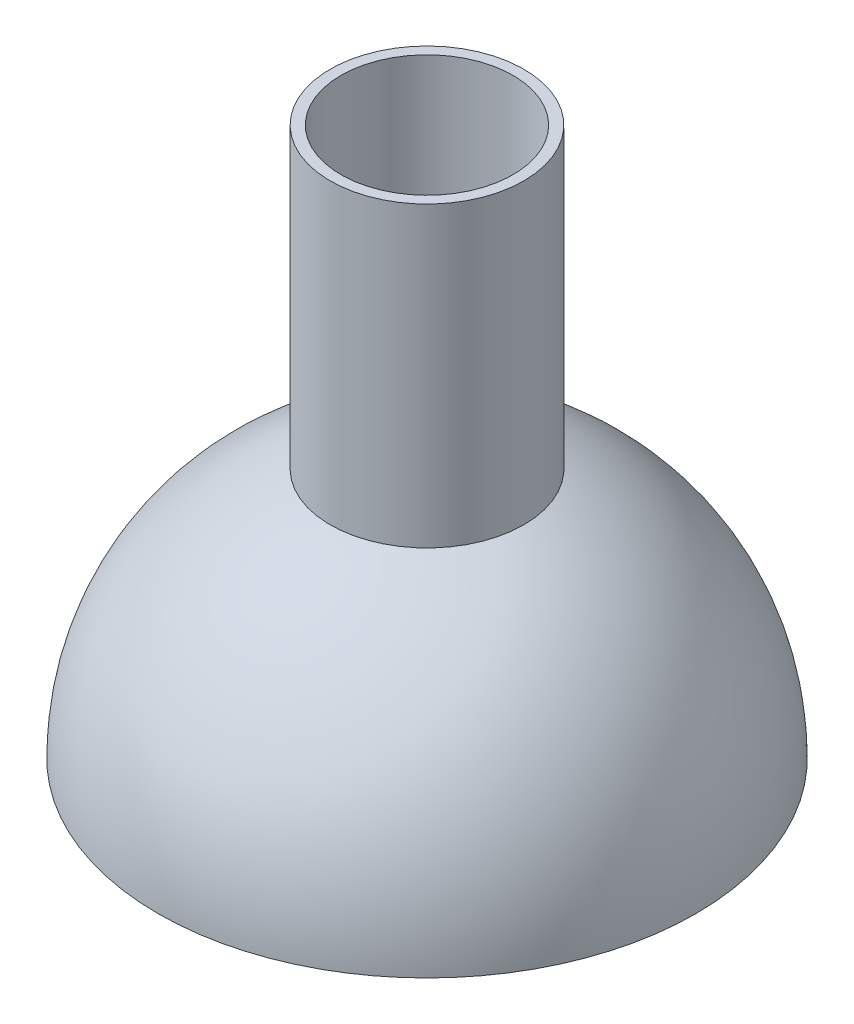
ISO-10303-21;
HEADER;
FILE_DESCRIPTION(('STEP AP214'),'2;1');
FILE_NAME('part.step','',(''),(''),'','','');
FILE_SCHEMA(('AUTOMOTIVE_DESIGN { 1 0 10303 214 1 1 1 1 }'));
ENDSEC;
DATA;
#1=APPLICATION_CONTEXT('core data for automotive mechanical design processes');
#2=APPLICATION_PROTOCOL_DEFINITION('international standard','automotive_design',2000,#1);
#3=PRODUCT_CONTEXT('',#1,'mechanical');
#4=PRODUCT('Part','Part','',(#3));
#5=PRODUCT_RELATED_PRODUCT_CATEGORY('part','',(#4));
#6=PRODUCT_DEFINITION_FORMATION('','',#4);
#7=PRODUCT_DEFINITION_CONTEXT('part definition',#1,'design');
#8=PRODUCT_DEFINITION('design','',#6,#7);
#9=PRODUCT_DEFINITION_SHAPE('','',#8);
#10=(LENGTH_UNIT() NAMED_UNIT(*) SI_UNIT(.MILLI.,.METRE.));
#11=(NAMED_UNIT(*) PLANE_ANGLE_UNIT() SI_UNIT($,.RADIAN.));
#12=(NAMED_UNIT(*) SI_UNIT($,.STERADIAN.) SOLID_ANGLE_UNIT());
#13=UNCERTAINTY_MEASURE_WITH_UNIT(LENGTH_MEASURE(1.E-05),#10,'distance_accuracy_value','');
#14=(GEOMETRIC_REPRESENTATION_CONTEXT(3) GLOBAL_UNCERTAINTY_ASSIGNED_CONTEXT((#13)) GLOBAL_UNIT_ASSIGNED_CONTEXT((#10,
#11,#12)) REPRESENTATION_CONTEXT('',''));
#15=CARTESIAN_POINT('',(0.,0.,0.));
#16=DIRECTION('',(0.,0.,1.));
#17=DIRECTION('',(1.,0.,0.));
#18=AXIS2_PLACEMENT_3D('',#15,#16,#17);
#19=CARTESIAN_POINT('',(-3.56131096562E-13,51.,0.));
#20=DIRECTION('',(0.,-1.,0.));
#21=DIRECTION('',(1.,0.,0.));
#22=AXIS2_PLACEMENT_3D('',#19,#20,#21);
#23=CYLINDRICAL_SURFACE('',#22,9.);
#24=CARTESIAN_POINT('',(-3.56131096562E-13,51.,0.));
#25=DIRECTION('',(0.,-1.,0.));
#26=DIRECTION('',(1.,0.,0.));
#27=AXIS2_PLACEMENT_3D('',#24,#25,#26);
#28=CIRCLE('',#27,9.);
#29=CARTESIAN_POINT('',(8.99999999999964,51.0000000000001,0.));
#30=VERTEX_POINT('',#29);
#31=EDGE_CURVE('E11',#30,#30,#28,.T.);
#32=ORIENTED_EDGE('',*,*,#31,.T.);
#33=EDGE_LOOP('',(#32));
#34=FACE_BOUND('',#33,.T.);
#35=CARTESIAN_POINT('',(-1.46642216231412E-13,21.,0.));
#36=DIRECTION('',(0.,-1.,0.));
#37=DIRECTION('',(1.,0.,0.));
#38=AXIS2_PLACEMENT_3D('',#35,#36,#37);
#39=CIRCLE('',#38,9.);
#40=CARTESIAN_POINT('',(8.99999999999985,21.0000000000001,0.));
#41=VERTEX_POINT('',#40);
#42=EDGE_CURVE('E46',#41,#41,#39,.T.);
#43=ORIENTED_EDGE('',*,*,#42,.F.);
#44=EDGE_LOOP('',(#43));
#45=FACE_BOUND('',#44,.T.);
#46=ADVANCED_FACE('F39',(#34,#45),#23,.T.);
#47=CARTESIAN_POINT('',(-3.56131096562E-13,51.,0.));
#48=DIRECTION('',(0.,-1.,0.));
#49=DIRECTION('',(1.,0.,0.));
#50=AXIS2_PLACEMENT_3D('',#47,#48,#49);
#51=PLANE('',#50);
#52=CARTESIAN_POINT('',(-3.56131096562E-13,51.,0.));
#53=DIRECTION('',(0.,1.,0.));
#54=DIRECTION('',(-1.,0.,0.));
#55=AXIS2_PLACEMENT_3D('',#52,#53,#54);
#56=CIRCLE('',#55,8.);
#57=CARTESIAN_POINT('',(-8.00000000000036,51.,0.));
#58=VERTEX_POINT('',#57);
#59=EDGE_CURVE('E52',#58,#58,#56,.T.);
#60=ORIENTED_EDGE('',*,*,#59,.F.);
#61=EDGE_LOOP('',(#60));
#62=FACE_BOUND('',#61,.T.);
#63=ORIENTED_EDGE('',*,*,#31,.F.);
#64=EDGE_LOOP('',(#63));
#65=FACE_BOUND('',#64,.T.);
#66=ADVANCED_FACE('F64',(#62,#65),#51,.F.);
#67=CARTESIAN_POINT('',(-1.46642216231412E-13,21.,0.));
#68=DIRECTION('',(0.,-1.,0.));
#69=DIRECTION('',(1.,0.,0.));
#70=AXIS2_PLACEMENT_3D('',#67,#68,#69);
#71=PLANE('',#70);
#72=CARTESIAN_POINT('',(-1.46642216231412E-13,21.,0.));
#73=DIRECTION('',(0.,-1.,0.));
#74=DIRECTION('',(1.,0.,0.));
#75=AXIS2_PLACEMENT_3D('',#72,#73,#74);
#76=CIRCLE('',#75,8.);
#77=CARTESIAN_POINT('',(7.99999999999985,21.0000000000001,0.));
#78=VERTEX_POINT('',#77);
#79=EDGE_CURVE('E42',#78,#78,#76,.T.);
#80=ORIENTED_EDGE('',*,*,#79,.F.);
#81=EDGE_LOOP('',(#80));
#82=FACE_BOUND('',#81,.T.);
#83=ORIENTED_EDGE('',*,*,#42,.T.);
#84=EDGE_LOOP('',(#83));
#85=FACE_BOUND('',#84,.T.);
#86=ADVANCED_FACE('F61',(#82,#85),#71,.T.);
#87=CARTESIAN_POINT('',(-1.1172740284298E-13,16.,0.));
#88=DIRECTION('',(0.,1.,0.));
#89=DIRECTION('',(-1.,0.,0.));
#90=AXIS2_PLACEMENT_3D('',#87,#88,#89);
#91=CYLINDRICAL_SURFACE('',#90,8.);
#92=ORIENTED_EDGE('',*,*,#79,.T.);
#93=EDGE_LOOP('',(#92));
#94=FACE_BOUND('',#93,.T.);
#95=ORIENTED_EDGE('',*,*,#59,.T.);
#96=EDGE_LOOP('',(#95));
#97=FACE_BOUND('',#96,.T.);
#98=ADVANCED_FACE('F59',(#94,#97),#91,.F.);
#99=CLOSED_SHELL('',(#46,#66,#86,#98));
#100=MANIFOLD_SOLID_BREP('B2',#99);
#101=CARTESIAN_POINT('',(0.,0.,0.));
#102=DIRECTION('',(0.,0.,-1.));
#103=DIRECTION('',(-1.,0.,0.));
#104=AXIS2_PLACEMENT_3D('',#101,#102,#103);
#105=SPHERICAL_SURFACE('',#104,25.);
#106=CARTESIAN_POINT('',(0.,0.,0.));
#107=DIRECTION('',(0.,-1.,0.));
#108=DIRECTION('',(1.,0.,0.));
#109=AXIS2_PLACEMENT_3D('',#106,#107,#108);
#110=SPHERICAL_SURFACE('',#109,25.);
#111=CARTESIAN_POINT('',(-1.6539453350161E-13,23.685438564654,0.));
#112=DIRECTION('',(0.,-1.,0.));
#113=DIRECTION('',(1.,0.,0.));
#114=AXIS2_PLACEMENT_3D('',#111,#112,#113);
#115=CIRCLE('',#114,8.);
#116=CARTESIAN_POINT('',(7.99999999999984,23.6854385646541,0.));
#117=VERTEX_POINT('',#116);
#118=EDGE_CURVE('E112',#117,#117,#115,.T.);
#119=ORIENTED_EDGE('',*,*,#118,.T.);
#120=EDGE_LOOP('',(#119));
#121=FACE_BOUND('',#120,.T.);
#122=CARTESIAN_POINT('',(0.,0.,0.));
#123=DIRECTION('',(0.,-1.,0.));
#124=DIRECTION('',(0.,0.,1.));
#125=AXIS2_PLACEMENT_3D('',#122,#123,#124);
#126=CIRCLE('',#125,25.);
#127=CARTESIAN_POINT('',(0.,0.,25.));
#128=VERTEX_POINT('',#127);
#129=EDGE_CURVE('E38',#128,#128,#126,.T.);
#130=ORIENTED_EDGE('',*,*,#129,.F.);
#131=EDGE_LOOP('',(#130));
#132=FACE_BOUND('',#131,.T.);
#133=ADVANCED_FACE('F101',(#121,#132),#110,.T.);
#134=CARTESIAN_POINT('',(0.,0.,0.));
#135=DIRECTION('',(0.,-1.,0.));
#136=DIRECTION('',(0.,0.,1.));
#137=AXIS2_PLACEMENT_3D('',#134,#135,#136);
#138=PLANE('',#137);
#139=CARTESIAN_POINT('',(0.,0.,0.));
#140=DIRECTION('',(0.,1.,0.));
#141=DIRECTION('',(-1.,0.,0.));
#142=AXIS2_PLACEMENT_3D('',#139,#140,#141);
#143=CIRCLE('',#142,20.);
#144=CARTESIAN_POINT('',(-20.,-2.79318507107451E-13,0.));
#145=VERTEX_POINT('',#144);
#146=EDGE_CURVE('E108',#145,#145,#143,.T.);
#147=ORIENTED_EDGE('',*,*,#146,.T.);
#148=EDGE_LOOP('',(#147));
#149=FACE_BOUND('',#148,.T.);
#150=ORIENTED_EDGE('',*,*,#129,.T.);
#151=EDGE_LOOP('',(#150));
#152=FACE_BOUND('',#151,.T.);
#153=ADVANCED_FACE('F131',(#149,#152),#138,.T.);
#154=CARTESIAN_POINT('',(0.,0.,0.));
#155=DIRECTION('',(0.,0.,-1.));
#156=DIRECTION('',(1.,0.,0.));
#157=AXIS2_PLACEMENT_3D('',#154,#155,#156);
#158=SPHERICAL_SURFACE('',#157,20.);
#159=CARTESIAN_POINT('',(0.,0.,0.));
#160=DIRECTION('',(0.,-1.,0.));
#161=DIRECTION('',(1.,0.,0.));
#162=AXIS2_PLACEMENT_3D('',#159,#160,#161);
#163=SPHERICAL_SURFACE('',#162,20.);
#164=CARTESIAN_POINT('',(-1.27999820182195E-13,18.3303027798234,0.));
#165=DIRECTION('',(0.,-1.,0.));
#166=DIRECTION('',(1.,0.,0.));
#167=AXIS2_PLACEMENT_3D('',#164,#165,#166);
#168=CIRCLE('',#167,8.);
#169=CARTESIAN_POINT('',(7.99999999999987,18.3303027798234,0.));
#170=VERTEX_POINT('',#169);
#171=EDGE_CURVE('E104',#170,#170,#168,.F.);
#172=ORIENTED_EDGE('',*,*,#171,.T.);
#173=EDGE_LOOP('',(#172));
#174=FACE_BOUND('',#173,.T.);
#175=ORIENTED_EDGE('',*,*,#146,.F.);
#176=EDGE_LOOP('',(#175));
#177=FACE_BOUND('',#176,.T.);
#178=ADVANCED_FACE('F121',(#174,#177),#163,.F.);
#179=CARTESIAN_POINT('',(-1.1172740284298E-13,16.,0.));
#180=DIRECTION('',(0.,1.,0.));
#181=DIRECTION('',(-1.,0.,0.));
#182=AXIS2_PLACEMENT_3D('',#179,#180,#181);
#183=CYLINDRICAL_SURFACE('',#182,8.);
#184=ORIENTED_EDGE('',*,*,#171,.F.);
#185=EDGE_LOOP('',(#184));
#186=FACE_BOUND('',#185,.T.);
#187=ORIENTED_EDGE('',*,*,#118,.F.);
#188=EDGE_LOOP('',(#187));
#189=FACE_BOUND('',#188,.T.);
#190=ADVANCED_FACE('F124',(#186,#189),#183,.F.);
#191=CLOSED_SHELL('',(#133,#153,#178,#190));
#192=MANIFOLD_SOLID_BREP('B6',#191);
#193=ADVANCED_BREP_SHAPE_REPRESENTATION('',(#18,#100,#192),#14);
#194=SHAPE_DEFINITION_REPRESENTATION(#9,#193);
ENDSEC;
END-ISO-10303-21;
